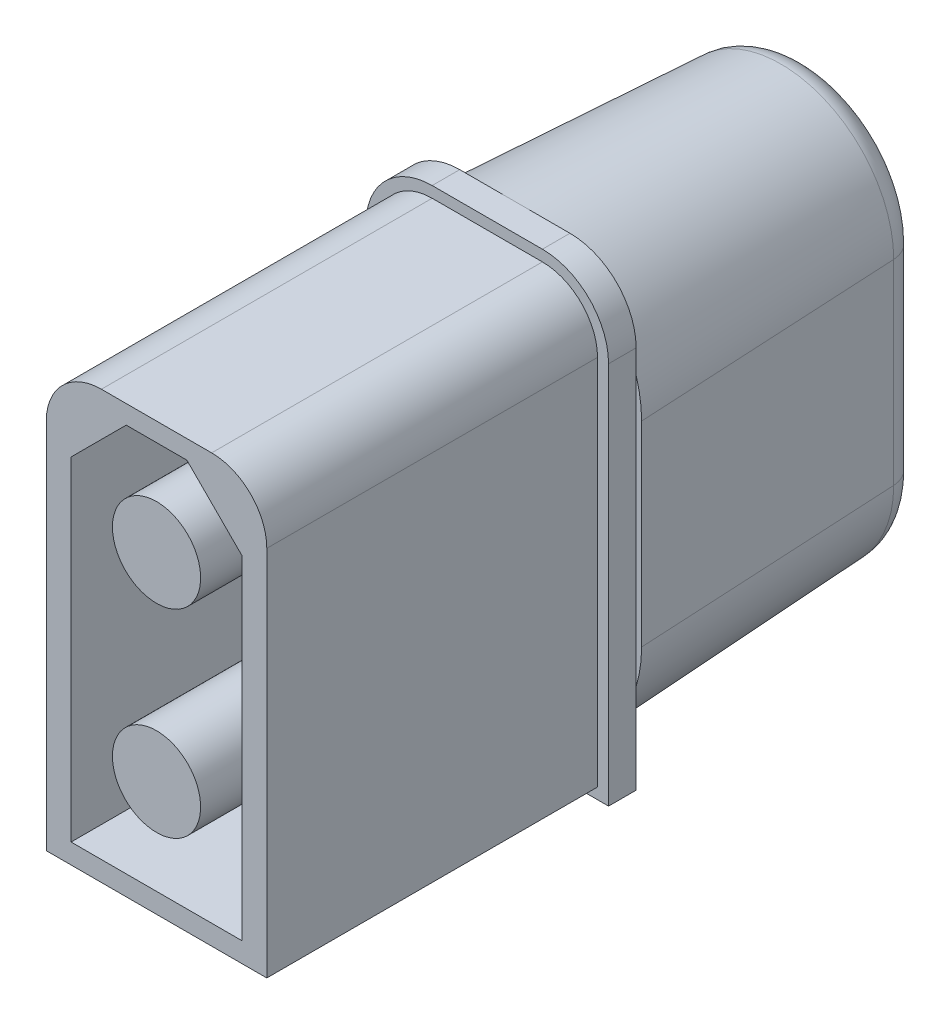
ISO-10303-21;
HEADER;
FILE_DESCRIPTION(('STEP AP214'),'2;1');
FILE_NAME('part.step','',(''),(''),'','','');
FILE_SCHEMA(('AUTOMOTIVE_DESIGN { 1 0 10303 214 1 1 1 1 }'));
ENDSEC;
DATA;
#1=APPLICATION_CONTEXT('core data for automotive mechanical design processes');
#2=APPLICATION_PROTOCOL_DEFINITION('international standard','automotive_design',2000,#1);
#3=PRODUCT_CONTEXT('',#1,'mechanical');
#4=PRODUCT('Part','Part','',(#3));
#5=PRODUCT_RELATED_PRODUCT_CATEGORY('part','',(#4));
#6=PRODUCT_DEFINITION_FORMATION('','',#4);
#7=PRODUCT_DEFINITION_CONTEXT('part definition',#1,'design');
#8=PRODUCT_DEFINITION('design','',#6,#7);
#9=PRODUCT_DEFINITION_SHAPE('','',#8);
#10=(LENGTH_UNIT() NAMED_UNIT(*) SI_UNIT(.MILLI.,.METRE.));
#11=(NAMED_UNIT(*) PLANE_ANGLE_UNIT() SI_UNIT($,.RADIAN.));
#12=(NAMED_UNIT(*) SI_UNIT($,.STERADIAN.) SOLID_ANGLE_UNIT());
#13=UNCERTAINTY_MEASURE_WITH_UNIT(LENGTH_MEASURE(1.E-05),#10,'distance_accuracy_value','');
#14=(GEOMETRIC_REPRESENTATION_CONTEXT(3) GLOBAL_UNCERTAINTY_ASSIGNED_CONTEXT((#13)) GLOBAL_UNIT_ASSIGNED_CONTEXT((#10,
#11,#12)) REPRESENTATION_CONTEXT('',''));
#15=CARTESIAN_POINT('',(0.,0.,0.));
#16=DIRECTION('',(0.,0.,1.));
#17=DIRECTION('',(1.,0.,0.));
#18=AXIS2_PLACEMENT_3D('',#15,#16,#17);
#19=CARTESIAN_POINT('',(3.1,10.65,-25.0327260079975));
#20=DIRECTION('',(0.,0.,1.));
#21=DIRECTION('',(1.,0.,0.));
#22=AXIS2_PLACEMENT_3D('',#19,#20,#21);
#23=CYLINDRICAL_SURFACE('',#22,1.6);
#24=CARTESIAN_POINT('',(3.1,10.65,-25.0327260079975));
#25=DIRECTION('',(0.,0.,-1.));
#26=DIRECTION('',(-1.,0.,0.));
#27=AXIS2_PLACEMENT_3D('',#24,#25,#26);
#28=CIRCLE('',#27,1.6);
#29=CARTESIAN_POINT('',(1.5,10.65,-25.0327260079975));
#30=VERTEX_POINT('',#29);
#31=EDGE_CURVE('E11',#30,#30,#28,.T.);
#32=ORIENTED_EDGE('',*,*,#31,.F.);
#33=EDGE_LOOP('',(#32));
#34=FACE_BOUND('',#33,.T.);
#35=CARTESIAN_POINT('',(3.1,10.65,-13.0327260079975));
#36=DIRECTION('',(0.,0.,-1.));
#37=DIRECTION('',(-1.,0.,0.));
#38=AXIS2_PLACEMENT_3D('',#35,#36,#37);
#39=CIRCLE('',#38,1.6);
#40=CARTESIAN_POINT('',(1.5,10.65,-13.0327260079975));
#41=VERTEX_POINT('',#40);
#42=EDGE_CURVE('E53',#41,#41,#39,.T.);
#43=ORIENTED_EDGE('',*,*,#42,.T.);
#44=EDGE_LOOP('',(#43));
#45=FACE_BOUND('',#44,.T.);
#46=ADVANCED_FACE('F51',(#34,#45),#23,.T.);
#47=CARTESIAN_POINT('',(0.,0.,-13.0327260079975));
#48=DIRECTION('',(0.,0.,-1.));
#49=DIRECTION('',(-1.,0.,0.));
#50=AXIS2_PLACEMENT_3D('',#47,#48,#49);
#51=PLANE('',#50);
#52=ORIENTED_EDGE('',*,*,#42,.F.);
#53=EDGE_LOOP('',(#52));
#54=FACE_BOUND('',#53,.T.);
#55=ADVANCED_FACE('F248',(#54),#51,.F.);
#56=CARTESIAN_POINT('',(3.1,3.45,-25.0327260079975));
#57=DIRECTION('',(0.,0.,1.));
#58=DIRECTION('',(1.,0.,0.));
#59=AXIS2_PLACEMENT_3D('',#56,#57,#58);
#60=CYLINDRICAL_SURFACE('',#59,1.6);
#61=CARTESIAN_POINT('',(3.1,3.45,-25.0327260079975));
#62=DIRECTION('',(0.,0.,-1.));
#63=DIRECTION('',(-1.,0.,0.));
#64=AXIS2_PLACEMENT_3D('',#61,#62,#63);
#65=CIRCLE('',#64,1.6);
#66=CARTESIAN_POINT('',(1.5,3.45,-25.0327260079975));
#67=VERTEX_POINT('',#66);
#68=EDGE_CURVE('E226',#67,#67,#65,.T.);
#69=ORIENTED_EDGE('',*,*,#68,.F.);
#70=EDGE_LOOP('',(#69));
#71=FACE_BOUND('',#70,.T.);
#72=CARTESIAN_POINT('',(3.1,3.45,-13.0327260079975));
#73=DIRECTION('',(0.,0.,-1.));
#74=DIRECTION('',(-1.,0.,0.));
#75=AXIS2_PLACEMENT_3D('',#72,#73,#74);
#76=CIRCLE('',#75,1.6);
#77=CARTESIAN_POINT('',(1.5,3.45,-13.0327260079975));
#78=VERTEX_POINT('',#77);
#79=EDGE_CURVE('E212',#78,#78,#76,.T.);
#80=ORIENTED_EDGE('',*,*,#79,.T.);
#81=EDGE_LOOP('',(#80));
#82=FACE_BOUND('',#81,.T.);
#83=ADVANCED_FACE('F237',(#71,#82),#60,.T.);
#84=CARTESIAN_POINT('',(0.,0.,-13.0327260079975));
#85=DIRECTION('',(0.,0.,-1.));
#86=DIRECTION('',(-1.,0.,0.));
#87=AXIS2_PLACEMENT_3D('',#84,#85,#86);
#88=PLANE('',#87);
#89=ORIENTED_EDGE('',*,*,#79,.F.);
#90=EDGE_LOOP('',(#89));
#91=FACE_BOUND('',#90,.T.);
#92=ADVANCED_FACE('F236',(#91),#88,.F.);
#93=CARTESIAN_POINT('',(0.,14.1,-25.0327260079975));
#94=DIRECTION('',(0.,1.,0.));
#95=DIRECTION('',(0.,0.,1.));
#96=AXIS2_PLACEMENT_3D('',#93,#94,#95);
#97=PLANE('',#96);
#98=DIRECTION('',(-1.,0.,0.));
#99=VECTOR('',#98,1.);
#100=CARTESIAN_POINT('',(0.,14.1,-13.0327260079975));
#101=LINE('',#100,#99);
#102=CARTESIAN_POINT('',(4.2,14.1,-13.0327260079975));
#103=VERTEX_POINT('',#102);
#104=CARTESIAN_POINT('',(2.,14.1,-13.0327260079975));
#105=VERTEX_POINT('',#104);
#106=EDGE_CURVE('E191',#103,#105,#101,.T.);
#107=ORIENTED_EDGE('',*,*,#106,.T.);
#108=DIRECTION('',(0.,0.,1.));
#109=VECTOR('',#108,1.);
#110=CARTESIAN_POINT('',(2.,14.1,-25.0327260079975));
#111=LINE('',#110,#109);
#112=CARTESIAN_POINT('',(2.,14.1,-25.0327260079975));
#113=VERTEX_POINT('',#112);
#114=EDGE_CURVE('E211',#113,#105,#111,.T.);
#115=ORIENTED_EDGE('',*,*,#114,.F.);
#116=DIRECTION('',(-1.,0.,0.));
#117=VECTOR('',#116,1.);
#118=CARTESIAN_POINT('',(0.,14.1,-25.0327260079975));
#119=LINE('',#118,#117);
#120=CARTESIAN_POINT('',(4.2,14.1,-25.0327260079975));
#121=VERTEX_POINT('',#120);
#122=EDGE_CURVE('E174',#121,#113,#119,.T.);
#123=ORIENTED_EDGE('',*,*,#122,.F.);
#124=DIRECTION('',(0.,0.,1.));
#125=VECTOR('',#124,1.);
#126=CARTESIAN_POINT('',(4.2,14.1,-25.0327260079975));
#127=LINE('',#126,#125);
#128=EDGE_CURVE('E202',#121,#103,#127,.T.);
#129=ORIENTED_EDGE('',*,*,#128,.T.);
#130=EDGE_LOOP('',(#107,#115,#123,#129));
#131=FACE_BOUND('',#130,.T.);
#132=ADVANCED_FACE('F238',(#131),#97,.F.);
#133=CARTESIAN_POINT('',(-6.05,6.05,-25.0327260079975));
#134=DIRECTION('',(-0.707106781186547,0.707106781186547,0.));
#135=DIRECTION('',(-0.707106781186548,-0.707106781186548,0.));
#136=AXIS2_PLACEMENT_3D('',#133,#134,#135);
#137=PLANE('',#136);
#138=DIRECTION('',(-0.707106781186548,-0.707106781186548,0.));
#139=VECTOR('',#138,1.);
#140=CARTESIAN_POINT('',(-6.05,6.05,-13.0327260079975));
#141=LINE('',#140,#139);
#142=CARTESIAN_POINT('',(0.,12.1,-13.0327260079975));
#143=VERTEX_POINT('',#142);
#144=EDGE_CURVE('E197',#105,#143,#141,.T.);
#145=ORIENTED_EDGE('',*,*,#144,.T.);
#146=DIRECTION('',(0.,0.,1.));
#147=VECTOR('',#146,1.);
#148=CARTESIAN_POINT('',(0.,12.1,-25.0327260079975));
#149=LINE('',#148,#147);
#150=CARTESIAN_POINT('',(0.,12.1,-25.0327260079975));
#151=VERTEX_POINT('',#150);
#152=EDGE_CURVE('E160',#151,#143,#149,.T.);
#153=ORIENTED_EDGE('',*,*,#152,.F.);
#154=DIRECTION('',(-0.707106781186548,-0.707106781186548,0.));
#155=VECTOR('',#154,1.);
#156=CARTESIAN_POINT('',(-6.05,6.05,-25.0327260079975));
#157=LINE('',#156,#155);
#158=EDGE_CURVE('E168',#113,#151,#157,.T.);
#159=ORIENTED_EDGE('',*,*,#158,.F.);
#160=ORIENTED_EDGE('',*,*,#114,.T.);
#161=EDGE_LOOP('',(#145,#153,#159,#160));
#162=FACE_BOUND('',#161,.T.);
#163=ADVANCED_FACE('F250',(#162),#137,.F.);
#164=CARTESIAN_POINT('',(0.,0.,-25.0327260079975));
#165=DIRECTION('',(-1.,0.,0.));
#166=DIRECTION('',(0.,0.,1.));
#167=AXIS2_PLACEMENT_3D('',#164,#165,#166);
#168=PLANE('',#167);
#169=DIRECTION('',(0.,-1.,0.));
#170=VECTOR('',#169,1.);
#171=CARTESIAN_POINT('',(0.,0.,-13.0327260079975));
#172=LINE('',#171,#170);
#173=CARTESIAN_POINT('',(0.,0.,-13.0327260079975));
#174=VERTEX_POINT('',#173);
#175=EDGE_CURVE('E152',#143,#174,#172,.T.);
#176=ORIENTED_EDGE('',*,*,#175,.T.);
#177=DIRECTION('',(0.,0.,1.));
#178=VECTOR('',#177,1.);
#179=CARTESIAN_POINT('',(0.,0.,-25.0327260079975));
#180=LINE('',#179,#178);
#181=CARTESIAN_POINT('',(0.,0.,-25.0327260079975));
#182=VERTEX_POINT('',#181);
#183=EDGE_CURVE('E148',#182,#174,#180,.T.);
#184=ORIENTED_EDGE('',*,*,#183,.F.);
#185=DIRECTION('',(0.,-1.,0.));
#186=VECTOR('',#185,1.);
#187=CARTESIAN_POINT('',(0.,0.,-25.0327260079975));
#188=LINE('',#187,#186);
#189=EDGE_CURVE('E151',#151,#182,#188,.T.);
#190=ORIENTED_EDGE('',*,*,#189,.F.);
#191=ORIENTED_EDGE('',*,*,#152,.T.);
#192=EDGE_LOOP('',(#176,#184,#190,#191));
#193=FACE_BOUND('',#192,.T.);
#194=ADVANCED_FACE('F146',(#193),#168,.F.);
#195=CARTESIAN_POINT('',(0.,0.,-25.0327260079975));
#196=DIRECTION('',(0.,-1.,0.));
#197=DIRECTION('',(0.,0.,-1.));
#198=AXIS2_PLACEMENT_3D('',#195,#196,#197);
#199=PLANE('',#198);
#200=DIRECTION('',(1.,0.,0.));
#201=VECTOR('',#200,1.);
#202=CARTESIAN_POINT('',(0.,0.,-13.0327260079975));
#203=LINE('',#202,#201);
#204=CARTESIAN_POINT('',(6.2,0.,-13.0327260079975));
#205=VERTEX_POINT('',#204);
#206=EDGE_CURVE('E199',#174,#205,#203,.T.);
#207=ORIENTED_EDGE('',*,*,#206,.T.);
#208=DIRECTION('',(0.,0.,1.));
#209=VECTOR('',#208,1.);
#210=CARTESIAN_POINT('',(6.2,0.,-25.0327260079975));
#211=LINE('',#210,#209);
#212=CARTESIAN_POINT('',(6.2,0.,-25.0327260079975));
#213=VERTEX_POINT('',#212);
#214=EDGE_CURVE('E158',#213,#205,#211,.T.);
#215=ORIENTED_EDGE('',*,*,#214,.F.);
#216=DIRECTION('',(1.,0.,0.));
#217=VECTOR('',#216,1.);
#218=CARTESIAN_POINT('',(0.,0.,-25.0327260079975));
#219=LINE('',#218,#217);
#220=EDGE_CURVE('E161',#182,#213,#219,.T.);
#221=ORIENTED_EDGE('',*,*,#220,.F.);
#222=ORIENTED_EDGE('',*,*,#183,.T.);
#223=EDGE_LOOP('',(#207,#215,#221,#222));
#224=FACE_BOUND('',#223,.T.);
#225=ADVANCED_FACE('F165',(#224),#199,.F.);
#226=CARTESIAN_POINT('',(6.2,0.,-25.0327260079975));
#227=DIRECTION('',(1.,0.,0.));
#228=DIRECTION('',(0.,0.,-1.));
#229=AXIS2_PLACEMENT_3D('',#226,#227,#228);
#230=PLANE('',#229);
#231=DIRECTION('',(0.,1.,0.));
#232=VECTOR('',#231,1.);
#233=CARTESIAN_POINT('',(6.2,0.,-13.0327260079975));
#234=LINE('',#233,#232);
#235=CARTESIAN_POINT('',(6.2,12.1,-13.0327260079975));
#236=VERTEX_POINT('',#235);
#237=EDGE_CURVE('E110',#205,#236,#234,.T.);
#238=ORIENTED_EDGE('',*,*,#237,.T.);
#239=DIRECTION('',(0.,0.,1.));
#240=VECTOR('',#239,1.);
#241=CARTESIAN_POINT('',(6.2,12.1,-25.0327260079975));
#242=LINE('',#241,#240);
#243=CARTESIAN_POINT('',(6.2,12.1,-25.0327260079975));
#244=VERTEX_POINT('',#243);
#245=EDGE_CURVE('E70',#244,#236,#242,.T.);
#246=ORIENTED_EDGE('',*,*,#245,.F.);
#247=DIRECTION('',(0.,1.,0.));
#248=VECTOR('',#247,1.);
#249=CARTESIAN_POINT('',(6.2,0.,-25.0327260079975));
#250=LINE('',#249,#248);
#251=EDGE_CURVE('E164',#213,#244,#250,.T.);
#252=ORIENTED_EDGE('',*,*,#251,.F.);
#253=ORIENTED_EDGE('',*,*,#214,.T.);
#254=EDGE_LOOP('',(#238,#246,#252,#253));
#255=FACE_BOUND('',#254,.T.);
#256=ADVANCED_FACE('F286',(#255),#230,.F.);
#257=CARTESIAN_POINT('',(5.1,12.7779728133344,-25.0327260079975));
#258=DIRECTION('',(0.,0.,1.));
#259=DIRECTION('',(1.,0.,0.));
#260=AXIS2_PLACEMENT_3D('',#257,#258,#259);
#261=CYLINDRICAL_SURFACE('',#260,2.);
#262=CARTESIAN_POINT('',(5.1,12.7779728133344,-13.0327260079975));
#263=DIRECTION('',(0.,0.,-1.));
#264=DIRECTION('',(-1.,0.,0.));
#265=AXIS2_PLACEMENT_3D('',#262,#263,#264);
#266=CIRCLE('',#265,2.);
#267=CARTESIAN_POINT('',(5.09999999999999,14.7779728133344,-13.0327260079975));
#268=VERTEX_POINT('',#267);
#269=CARTESIAN_POINT('',(7.1,12.7779728133344,-13.0327260079975));
#270=VERTEX_POINT('',#269);
#271=EDGE_CURVE('E178',#268,#270,#266,.T.);
#272=ORIENTED_EDGE('',*,*,#271,.T.);
#273=DIRECTION('',(0.,0.,1.));
#274=VECTOR('',#273,1.);
#275=CARTESIAN_POINT('',(7.1,12.7779728133344,-25.0327260079975));
#276=LINE('',#275,#274);
#277=CARTESIAN_POINT('',(7.1,12.7779728133344,-25.0327260079975));
#278=VERTEX_POINT('',#277);
#279=EDGE_CURVE('E210',#278,#270,#276,.T.);
#280=ORIENTED_EDGE('',*,*,#279,.F.);
#281=CARTESIAN_POINT('',(5.1,12.7779728133344,-25.0327260079975));
#282=DIRECTION('',(0.,0.,-1.));
#283=DIRECTION('',(-1.,0.,0.));
#284=AXIS2_PLACEMENT_3D('',#281,#282,#283);
#285=CIRCLE('',#284,2.);
#286=CARTESIAN_POINT('',(5.09999999999999,14.7779728133344,-25.0327260079975));
#287=VERTEX_POINT('',#286);
#288=EDGE_CURVE('E204',#287,#278,#285,.T.);
#289=ORIENTED_EDGE('',*,*,#288,.F.);
#290=DIRECTION('',(0.,0.,1.));
#291=VECTOR('',#290,1.);
#292=CARTESIAN_POINT('',(5.09999999999999,14.7779728133344,-25.0327260079975));
#293=LINE('',#292,#291);
#294=EDGE_CURVE('E176',#287,#268,#293,.T.);
#295=ORIENTED_EDGE('',*,*,#294,.T.);
#296=EDGE_LOOP('',(#272,#280,#289,#295));
#297=FACE_BOUND('',#296,.T.);
#298=ADVANCED_FACE('F295',(#297),#261,.T.);
#299=CARTESIAN_POINT('',(7.1,0.,-25.0327260079975));
#300=DIRECTION('',(-1.,0.,0.));
#301=DIRECTION('',(0.,-1.,0.));
#302=AXIS2_PLACEMENT_3D('',#299,#300,#301);
#303=PLANE('',#302);
#304=DIRECTION('',(0.,-1.,0.));
#305=VECTOR('',#304,1.);
#306=CARTESIAN_POINT('',(7.1,0.,-13.0327260079975));
#307=LINE('',#306,#305);
#308=CARTESIAN_POINT('',(7.1,-0.722027186665562,-13.0327260079975));
#309=VERTEX_POINT('',#308);
#310=EDGE_CURVE('E181',#270,#309,#307,.T.);
#311=ORIENTED_EDGE('',*,*,#310,.T.);
#312=DIRECTION('',(0.,0.,1.));
#313=VECTOR('',#312,1.);
#314=CARTESIAN_POINT('',(7.1,-0.722027186665562,-25.0327260079975));
#315=LINE('',#314,#313);
#316=CARTESIAN_POINT('',(7.1,-0.722027186665562,-25.0327260079975));
#317=VERTEX_POINT('',#316);
#318=EDGE_CURVE('E228',#317,#309,#315,.T.);
#319=ORIENTED_EDGE('',*,*,#318,.F.);
#320=DIRECTION('',(0.,-1.,0.));
#321=VECTOR('',#320,1.);
#322=CARTESIAN_POINT('',(7.1,0.,-25.0327260079975));
#323=LINE('',#322,#321);
#324=EDGE_CURVE('E125',#278,#317,#323,.T.);
#325=ORIENTED_EDGE('',*,*,#324,.F.);
#326=ORIENTED_EDGE('',*,*,#279,.T.);
#327=EDGE_LOOP('',(#311,#319,#325,#326));
#328=FACE_BOUND('',#327,.T.);
#329=ADVANCED_FACE('F314',(#328),#303,.F.);
#330=CARTESIAN_POINT('',(0.,-0.722027186665563,-25.0327260079975));
#331=DIRECTION('',(0.,1.,0.));
#332=DIRECTION('',(-1.,0.,0.));
#333=AXIS2_PLACEMENT_3D('',#330,#331,#332);
#334=PLANE('',#333);
#335=DIRECTION('',(-1.,0.,0.));
#336=VECTOR('',#335,1.);
#337=CARTESIAN_POINT('',(0.,-0.722027186665563,-13.0327260079975));
#338=LINE('',#337,#336);
#339=CARTESIAN_POINT('',(-0.900000000000001,-0.722027186665563,-13.0327260079975));
#340=VERTEX_POINT('',#339);
#341=EDGE_CURVE('E188',#309,#340,#338,.T.);
#342=ORIENTED_EDGE('',*,*,#341,.T.);
#343=DIRECTION('',(0.,0.,1.));
#344=VECTOR('',#343,1.);
#345=CARTESIAN_POINT('',(-0.900000000000001,-0.722027186665563,-25.0327260079975));
#346=LINE('',#345,#344);
#347=CARTESIAN_POINT('',(-0.900000000000001,-0.722027186665563,-25.0327260079975));
#348=VERTEX_POINT('',#347);
#349=EDGE_CURVE('E224',#348,#340,#346,.T.);
#350=ORIENTED_EDGE('',*,*,#349,.F.);
#351=DIRECTION('',(-1.,0.,0.));
#352=VECTOR('',#351,1.);
#353=CARTESIAN_POINT('',(0.,-0.722027186665563,-25.0327260079975));
#354=LINE('',#353,#352);
#355=EDGE_CURVE('E331',#317,#348,#354,.T.);
#356=ORIENTED_EDGE('',*,*,#355,.F.);
#357=ORIENTED_EDGE('',*,*,#318,.T.);
#358=EDGE_LOOP('',(#342,#350,#356,#357));
#359=FACE_BOUND('',#358,.T.);
#360=ADVANCED_FACE('F309',(#359),#334,.F.);
#361=CARTESIAN_POINT('',(-0.900000000000001,0.,-25.0327260079975));
#362=DIRECTION('',(1.,0.,0.));
#363=DIRECTION('',(0.,1.,0.));
#364=AXIS2_PLACEMENT_3D('',#361,#362,#363);
#365=PLANE('',#364);
#366=DIRECTION('',(0.,1.,0.));
#367=VECTOR('',#366,1.);
#368=CARTESIAN_POINT('',(-0.900000000000001,0.,-13.0327260079975));
#369=LINE('',#368,#367);
#370=CARTESIAN_POINT('',(-0.9,12.7779728133344,-13.0327260079975));
#371=VERTEX_POINT('',#370);
#372=EDGE_CURVE('E187',#340,#371,#369,.T.);
#373=ORIENTED_EDGE('',*,*,#372,.T.);
#374=DIRECTION('',(0.,0.,1.));
#375=VECTOR('',#374,1.);
#376=CARTESIAN_POINT('',(-0.9,12.7779728133344,-25.0327260079975));
#377=LINE('',#376,#375);
#378=CARTESIAN_POINT('',(-0.9,12.7779728133344,-25.0327260079975));
#379=VERTEX_POINT('',#378);
#380=EDGE_CURVE('E219',#379,#371,#377,.T.);
#381=ORIENTED_EDGE('',*,*,#380,.F.);
#382=DIRECTION('',(0.,1.,0.));
#383=VECTOR('',#382,1.);
#384=CARTESIAN_POINT('',(-0.900000000000001,0.,-25.0327260079975));
#385=LINE('',#384,#383);
#386=EDGE_CURVE('E339',#348,#379,#385,.T.);
#387=ORIENTED_EDGE('',*,*,#386,.F.);
#388=ORIENTED_EDGE('',*,*,#349,.T.);
#389=EDGE_LOOP('',(#373,#381,#387,#388));
#390=FACE_BOUND('',#389,.T.);
#391=ADVANCED_FACE('F308',(#390),#365,.F.);
#392=CARTESIAN_POINT('',(1.1,12.7779728133344,-25.0327260079975));
#393=DIRECTION('',(0.,0.,1.));
#394=DIRECTION('',(1.,0.,0.));
#395=AXIS2_PLACEMENT_3D('',#392,#393,#394);
#396=CYLINDRICAL_SURFACE('',#395,2.);
#397=CARTESIAN_POINT('',(1.1,12.7779728133344,-13.0327260079975));
#398=DIRECTION('',(0.,0.,-1.));
#399=DIRECTION('',(-1.,0.,0.));
#400=AXIS2_PLACEMENT_3D('',#397,#398,#399);
#401=CIRCLE('',#400,2.);
#402=CARTESIAN_POINT('',(1.10000000000001,14.7779728133344,-13.0327260079975));
#403=VERTEX_POINT('',#402);
#404=EDGE_CURVE('E186',#371,#403,#401,.T.);
#405=ORIENTED_EDGE('',*,*,#404,.T.);
#406=DIRECTION('',(0.,0.,1.));
#407=VECTOR('',#406,1.);
#408=CARTESIAN_POINT('',(1.10000000000001,14.7779728133344,-25.0327260079975));
#409=LINE('',#408,#407);
#410=CARTESIAN_POINT('',(1.10000000000001,14.7779728133344,-25.0327260079975));
#411=VERTEX_POINT('',#410);
#412=EDGE_CURVE('E220',#411,#403,#409,.T.);
#413=ORIENTED_EDGE('',*,*,#412,.F.);
#414=CARTESIAN_POINT('',(1.1,12.7779728133344,-25.0327260079975));
#415=DIRECTION('',(0.,0.,-1.));
#416=DIRECTION('',(-1.,0.,0.));
#417=AXIS2_PLACEMENT_3D('',#414,#415,#416);
#418=CIRCLE('',#417,2.);
#419=EDGE_CURVE('E347',#379,#411,#418,.T.);
#420=ORIENTED_EDGE('',*,*,#419,.F.);
#421=ORIENTED_EDGE('',*,*,#380,.T.);
#422=EDGE_LOOP('',(#405,#413,#420,#421));
#423=FACE_BOUND('',#422,.T.);
#424=ADVANCED_FACE('F305',(#423),#396,.T.);
#425=CARTESIAN_POINT('',(0.,14.7779728133344,-25.0327260079975));
#426=DIRECTION('',(0.,-1.,0.));
#427=DIRECTION('',(1.,0.,0.));
#428=AXIS2_PLACEMENT_3D('',#425,#426,#427);
#429=PLANE('',#428);
#430=DIRECTION('',(1.,0.,0.));
#431=VECTOR('',#430,1.);
#432=CARTESIAN_POINT('',(0.,14.7779728133344,-13.0327260079975));
#433=LINE('',#432,#431);
#434=EDGE_CURVE('E195',#403,#268,#433,.T.);
#435=ORIENTED_EDGE('',*,*,#434,.T.);
#436=ORIENTED_EDGE('',*,*,#294,.F.);
#437=DIRECTION('',(1.,0.,0.));
#438=VECTOR('',#437,1.);
#439=CARTESIAN_POINT('',(0.,14.7779728133344,-25.0327260079975));
#440=LINE('',#439,#438);
#441=EDGE_CURVE('E349',#411,#287,#440,.T.);
#442=ORIENTED_EDGE('',*,*,#441,.F.);
#443=ORIENTED_EDGE('',*,*,#412,.T.);
#444=EDGE_LOOP('',(#435,#436,#442,#443));
#445=FACE_BOUND('',#444,.T.);
#446=ADVANCED_FACE('F289',(#445),#429,.F.);
#447=CARTESIAN_POINT('',(9.15,9.15,-25.0327260079975));
#448=DIRECTION('',(0.707106781186547,0.707106781186547,0.));
#449=DIRECTION('',(-0.707106781186548,0.707106781186548,0.));
#450=AXIS2_PLACEMENT_3D('',#447,#448,#449);
#451=PLANE('',#450);
#452=DIRECTION('',(-0.707106781186548,0.707106781186548,0.));
#453=VECTOR('',#452,1.);
#454=CARTESIAN_POINT('',(9.15,9.15,-13.0327260079975));
#455=LINE('',#454,#453);
#456=EDGE_CURVE('E114',#236,#103,#455,.T.);
#457=ORIENTED_EDGE('',*,*,#456,.T.);
#458=ORIENTED_EDGE('',*,*,#128,.F.);
#459=DIRECTION('',(-0.707106781186548,0.707106781186548,0.));
#460=VECTOR('',#459,1.);
#461=CARTESIAN_POINT('',(9.15,9.15,-25.0327260079975));
#462=LINE('',#461,#460);
#463=EDGE_CURVE('E180',#244,#121,#462,.T.);
#464=ORIENTED_EDGE('',*,*,#463,.F.);
#465=ORIENTED_EDGE('',*,*,#245,.T.);
#466=EDGE_LOOP('',(#457,#458,#464,#465));
#467=FACE_BOUND('',#466,.T.);
#468=ADVANCED_FACE('F276',(#467),#451,.F.);
#469=CARTESIAN_POINT('',(0.,0.,-13.0327260079975));
#470=DIRECTION('',(0.,0.,-1.));
#471=DIRECTION('',(-1.,0.,0.));
#472=AXIS2_PLACEMENT_3D('',#469,#470,#471);
#473=PLANE('',#472);
#474=ORIENTED_EDGE('',*,*,#271,.F.);
#475=ORIENTED_EDGE('',*,*,#434,.F.);
#476=ORIENTED_EDGE('',*,*,#404,.F.);
#477=ORIENTED_EDGE('',*,*,#372,.F.);
#478=ORIENTED_EDGE('',*,*,#341,.F.);
#479=ORIENTED_EDGE('',*,*,#310,.F.);
#480=EDGE_LOOP('',(#474,#475,#476,#477,#478,#479));
#481=FACE_BOUND('',#480,.T.);
#482=ORIENTED_EDGE('',*,*,#106,.F.);
#483=ORIENTED_EDGE('',*,*,#456,.F.);
#484=ORIENTED_EDGE('',*,*,#237,.F.);
#485=ORIENTED_EDGE('',*,*,#206,.F.);
#486=ORIENTED_EDGE('',*,*,#175,.F.);
#487=ORIENTED_EDGE('',*,*,#144,.F.);
#488=EDGE_LOOP('',(#482,#483,#484,#485,#486,#487));
#489=FACE_BOUND('',#488,.T.);
#490=ADVANCED_FACE('F268',(#481,#489),#473,.F.);
#491=CARTESIAN_POINT('',(5.09999999999998,15.1779728133344,-25.0327260079975));
#492=DIRECTION('',(0.,0.,1.));
#493=DIRECTION('',(-1.,0.,0.));
#494=AXIS2_PLACEMENT_3D('',#491,#492,#493);
#495=PLANE('',#494);
#496=ORIENTED_EDGE('',*,*,#31,.T.);
#497=EDGE_LOOP('',(#496));
#498=FACE_BOUND('',#497,.T.);
#499=ORIENTED_EDGE('',*,*,#68,.T.);
#500=EDGE_LOOP('',(#499));
#501=FACE_BOUND('',#500,.T.);
#502=ORIENTED_EDGE('',*,*,#463,.T.);
#503=ORIENTED_EDGE('',*,*,#122,.T.);
#504=ORIENTED_EDGE('',*,*,#158,.T.);
#505=ORIENTED_EDGE('',*,*,#189,.T.);
#506=ORIENTED_EDGE('',*,*,#220,.T.);
#507=ORIENTED_EDGE('',*,*,#251,.T.);
#508=EDGE_LOOP('',(#502,#503,#504,#505,#506,#507));
#509=FACE_BOUND('',#508,.T.);
#510=ADVANCED_FACE('F169',(#498,#501,#509),#495,.T.);
#511=ORIENTED_EDGE('',*,*,#441,.T.);
#512=ORIENTED_EDGE('',*,*,#288,.T.);
#513=ORIENTED_EDGE('',*,*,#324,.T.);
#514=ORIENTED_EDGE('',*,*,#355,.T.);
#515=ORIENTED_EDGE('',*,*,#386,.T.);
#516=ORIENTED_EDGE('',*,*,#419,.T.);
#517=EDGE_LOOP('',(#511,#512,#513,#514,#515,#516));
#518=FACE_BOUND('',#517,.T.);
#519=DIRECTION('',(-1.,0.,0.));
#520=VECTOR('',#519,1.);
#521=CARTESIAN_POINT('',(0.,15.1779728133344,-25.0327260079975));
#522=LINE('',#521,#520);
#523=CARTESIAN_POINT('',(5.09999999999998,15.1779728133344,-25.0327260079975));
#524=VERTEX_POINT('',#523);
#525=CARTESIAN_POINT('',(1.10000000000001,15.1779728133344,-25.0327260079975));
#526=VERTEX_POINT('',#525);
#527=EDGE_CURVE('E518',#524,#526,#522,.T.);
#528=ORIENTED_EDGE('',*,*,#527,.T.);
#529=CARTESIAN_POINT('',(1.1,12.7779728133344,-25.0327260079975));
#530=DIRECTION('',(0.,0.,1.));
#531=DIRECTION('',(1.,0.,0.));
#532=AXIS2_PLACEMENT_3D('',#529,#530,#531);
#533=CIRCLE('',#532,2.4);
#534=CARTESIAN_POINT('',(-1.3,12.7779728133344,-25.0327260079975));
#535=VERTEX_POINT('',#534);
#536=EDGE_CURVE('E546',#526,#535,#533,.T.);
#537=ORIENTED_EDGE('',*,*,#536,.T.);
#538=DIRECTION('',(0.,-1.,0.));
#539=VECTOR('',#538,1.);
#540=CARTESIAN_POINT('',(-1.3,0.,-25.0327260079975));
#541=LINE('',#540,#539);
#542=CARTESIAN_POINT('',(-1.3,-1.12202718666556,-25.0327260079975));
#543=VERTEX_POINT('',#542);
#544=EDGE_CURVE('E543',#535,#543,#541,.T.);
#545=ORIENTED_EDGE('',*,*,#544,.T.);
#546=DIRECTION('',(1.,0.,0.));
#547=VECTOR('',#546,1.);
#548=CARTESIAN_POINT('',(0.,-1.12202718666556,-25.0327260079975));
#549=LINE('',#548,#547);
#550=CARTESIAN_POINT('',(7.5,-1.12202718666556,-25.0327260079975));
#551=VERTEX_POINT('',#550);
#552=EDGE_CURVE('E539',#543,#551,#549,.T.);
#553=ORIENTED_EDGE('',*,*,#552,.T.);
#554=DIRECTION('',(0.,1.,0.));
#555=VECTOR('',#554,1.);
#556=CARTESIAN_POINT('',(7.5,0.,-25.0327260079975));
#557=LINE('',#556,#555);
#558=CARTESIAN_POINT('',(7.5,12.7779728133344,-25.0327260079975));
#559=VERTEX_POINT('',#558);
#560=EDGE_CURVE('E536',#551,#559,#557,.T.);
#561=ORIENTED_EDGE('',*,*,#560,.T.);
#562=CARTESIAN_POINT('',(5.1,12.7779728133344,-25.0327260079975));
#563=DIRECTION('',(0.,0.,1.));
#564=DIRECTION('',(1.,0.,0.));
#565=AXIS2_PLACEMENT_3D('',#562,#563,#564);
#566=CIRCLE('',#565,2.4);
#567=EDGE_CURVE('E531',#559,#524,#566,.T.);
#568=ORIENTED_EDGE('',*,*,#567,.T.);
#569=EDGE_LOOP('',(#528,#537,#545,#553,#561,#568));
#570=FACE_BOUND('',#569,.T.);
#571=ADVANCED_FACE('F270',(#518,#570),#495,.T.);
#572=CARTESIAN_POINT('',(0.,0.,-26.0327260079975));
#573=DIRECTION('',(0.,0.,-1.));
#574=DIRECTION('',(1.,0.,0.));
#575=AXIS2_PLACEMENT_3D('',#572,#573,#574);
#576=PLANE('',#575);
#577=CARTESIAN_POINT('',(3.1,3.42797281333444,-26.0327260079975));
#578=DIRECTION('',(0.,0.,1.));
#579=DIRECTION('',(1.,0.,0.));
#580=AXIS2_PLACEMENT_3D('',#577,#578,#579);
#581=CIRCLE('',#580,2.75);
#582=CARTESIAN_POINT('',(5.85,3.42797281333444,-26.0327260079975));
#583=VERTEX_POINT('',#582);
#584=EDGE_CURVE('E488',#583,#583,#581,.T.);
#585=ORIENTED_EDGE('',*,*,#584,.F.);
#586=EDGE_LOOP('',(#585));
#587=FACE_BOUND('',#586,.T.);
#588=ADVANCED_FACE('F277',(#587),#576,.T.);
#589=CARTESIAN_POINT('',(3.1,10.6279728133344,-26.0327260079975));
#590=DIRECTION('',(0.,0.,1.));
#591=DIRECTION('',(1.,0.,0.));
#592=AXIS2_PLACEMENT_3D('',#589,#590,#591);
#593=CIRCLE('',#592,2.75);
#594=CARTESIAN_POINT('',(5.85,10.6279728133344,-26.0327260079975));
#595=VERTEX_POINT('',#594);
#596=EDGE_CURVE('E580',#595,#595,#593,.T.);
#597=ORIENTED_EDGE('',*,*,#596,.F.);
#598=EDGE_LOOP('',(#597));
#599=FACE_BOUND('',#598,.T.);
#600=ADVANCED_FACE('F595',(#599),#576,.T.);
#601=CARTESIAN_POINT('',(3.1,3.42797281333444,-36.6327260079975));
#602=DIRECTION('',(0.,0.,1.));
#603=DIRECTION('',(-1.,0.,0.));
#604=AXIS2_PLACEMENT_3D('',#601,#602,#603);
#605=CYLINDRICAL_SURFACE('',#604,2.75);
#606=CARTESIAN_POINT('',(3.1,3.42797281333444,-36.6327260079975));
#607=DIRECTION('',(0.,0.,1.));
#608=DIRECTION('',(1.,0.,0.));
#609=AXIS2_PLACEMENT_3D('',#606,#607,#608);
#610=CIRCLE('',#609,2.75);
#611=CARTESIAN_POINT('',(5.85,3.42797281333444,-36.6327260079975));
#612=VERTEX_POINT('',#611);
#613=EDGE_CURVE('E578',#612,#612,#610,.T.);
#614=ORIENTED_EDGE('',*,*,#613,.F.);
#615=EDGE_LOOP('',(#614));
#616=FACE_BOUND('',#615,.T.);
#617=ORIENTED_EDGE('',*,*,#584,.T.);
#618=EDGE_LOOP('',(#617));
#619=FACE_BOUND('',#618,.T.);
#620=ADVANCED_FACE('F282',(#616,#619),#605,.F.);
#621=CARTESIAN_POINT('',(3.1,10.6279728133344,-36.6327260079975));
#622=DIRECTION('',(0.,0.,1.));
#623=DIRECTION('',(-1.,0.,0.));
#624=AXIS2_PLACEMENT_3D('',#621,#622,#623);
#625=CYLINDRICAL_SURFACE('',#624,2.75);
#626=CARTESIAN_POINT('',(3.1,10.6279728133344,-36.6327260079975));
#627=DIRECTION('',(0.,0.,1.));
#628=DIRECTION('',(1.,0.,0.));
#629=AXIS2_PLACEMENT_3D('',#626,#627,#628);
#630=CIRCLE('',#629,2.75);
#631=CARTESIAN_POINT('',(5.85,10.6279728133344,-36.6327260079975));
#632=VERTEX_POINT('',#631);
#633=EDGE_CURVE('E583',#632,#632,#630,.T.);
#634=ORIENTED_EDGE('',*,*,#633,.F.);
#635=EDGE_LOOP('',(#634));
#636=FACE_BOUND('',#635,.T.);
#637=ORIENTED_EDGE('',*,*,#596,.T.);
#638=EDGE_LOOP('',(#637));
#639=FACE_BOUND('',#638,.T.);
#640=ADVANCED_FACE('F591',(#636,#639),#625,.F.);
#641=CARTESIAN_POINT('',(3.1,10.5779728133344,-36.6327260079975));
#642=DIRECTION('',(0.,0.,-1.));
#643=DIRECTION('',(1.,0.,0.));
#644=AXIS2_PLACEMENT_3D('',#641,#642,#643);
#645=PLANE('',#644);
#646=DIRECTION('',(0.,-1.,0.));
#647=VECTOR('',#646,1.);
#648=CARTESIAN_POINT('',(6.19551297288488,10.5779728133344,-36.6327260079975));
#649=LINE('',#648,#647);
#650=CARTESIAN_POINT('',(6.19551297288488,3.47797281333444,-36.6327260079975));
#651=VERTEX_POINT('',#650);
#652=CARTESIAN_POINT('',(6.19551297288488,10.5779728133344,-36.6327260079975));
#653=VERTEX_POINT('',#652);
#654=EDGE_CURVE('E496',#651,#653,#649,.F.);
#655=ORIENTED_EDGE('',*,*,#654,.F.);
#656=CARTESIAN_POINT('',(3.1,3.47797281333444,-36.6327260079975));
#657=DIRECTION('',(0.,0.,1.));
#658=DIRECTION('',(1.,0.,0.));
#659=AXIS2_PLACEMENT_3D('',#656,#657,#658);
#660=CIRCLE('',#659,3.09551297288488);
#661=CARTESIAN_POINT('',(0.00448702711511838,3.47797281333444,-36.6327260079975));
#662=VERTEX_POINT('',#661);
#663=EDGE_CURVE('E504',#662,#651,#660,.T.);
#664=ORIENTED_EDGE('',*,*,#663,.F.);
#665=DIRECTION('',(0.,1.,0.));
#666=VECTOR('',#665,1.);
#667=CARTESIAN_POINT('',(0.00448702711511838,3.47797281333444,-36.6327260079975));
#668=LINE('',#667,#666);
#669=CARTESIAN_POINT('',(0.00448702711511838,10.5779728133344,-36.6327260079975));
#670=VERTEX_POINT('',#669);
#671=EDGE_CURVE('E485',#670,#662,#668,.F.);
#672=ORIENTED_EDGE('',*,*,#671,.F.);
#673=CARTESIAN_POINT('',(3.1,10.5779728133344,-36.6327260079975));
#674=DIRECTION('',(0.,0.,1.));
#675=DIRECTION('',(1.,0.,0.));
#676=AXIS2_PLACEMENT_3D('',#673,#674,#675);
#677=CIRCLE('',#676,3.09551297288488);
#678=EDGE_CURVE('E497',#653,#670,#677,.T.);
#679=ORIENTED_EDGE('',*,*,#678,.F.);
#680=EDGE_LOOP('',(#655,#664,#672,#679));
#681=FACE_BOUND('',#680,.T.);
#682=ORIENTED_EDGE('',*,*,#633,.T.);
#683=EDGE_LOOP('',(#682));
#684=FACE_BOUND('',#683,.T.);
#685=ORIENTED_EDGE('',*,*,#613,.T.);
#686=EDGE_LOOP('',(#685));
#687=FACE_BOUND('',#686,.T.);
#688=ADVANCED_FACE('F586',(#681,#684,#687),#645,.T.);
#689=CARTESIAN_POINT('',(0.00448702711511838,10.5779728133344,-35.6327260079975));
#690=DIRECTION('',(0.,-1.,0.));
#691=DIRECTION('',(0.,0.,1.));
#692=AXIS2_PLACEMENT_3D('',#689,#690,#691);
#693=CYLINDRICAL_SURFACE('',#692,1.);
#694=CARTESIAN_POINT('',(0.00448702711511751,3.47797281333444,-35.6327260079975));
#695=DIRECTION('',(0.,-1.,0.));
#696=DIRECTION('',(0.,0.,-1.));
#697=AXIS2_PLACEMENT_3D('',#694,#695,#696);
#698=CIRCLE('',#697,1.);
#699=CARTESIAN_POINT('',(-0.994142507639457,3.47797281333444,-35.6850619642405));
#700=VERTEX_POINT('',#699);
#701=EDGE_CURVE('E469',#700,#662,#698,.T.);
#702=ORIENTED_EDGE('',*,*,#701,.F.);
#703=DIRECTION('',(0.,-1.,0.));
#704=VECTOR('',#703,1.);
#705=CARTESIAN_POINT('',(-0.994142507639456,10.5779728133344,-35.6850619642405));
#706=LINE('',#705,#704);
#707=CARTESIAN_POINT('',(-0.994142507639456,10.5779728133344,-35.6850619642405));
#708=VERTEX_POINT('',#707);
#709=EDGE_CURVE('E472',#700,#708,#706,.F.);
#710=ORIENTED_EDGE('',*,*,#709,.T.);
#711=CARTESIAN_POINT('',(0.00448702711511838,10.5779728133344,-35.6327260079975));
#712=DIRECTION('',(0.,-1.,0.));
#713=DIRECTION('',(0.,0.,-1.));
#714=AXIS2_PLACEMENT_3D('',#711,#712,#713);
#715=CIRCLE('',#714,1.);
#716=EDGE_CURVE('E184',#708,#670,#715,.T.);
#717=ORIENTED_EDGE('',*,*,#716,.T.);
#718=ORIENTED_EDGE('',*,*,#671,.T.);
#719=EDGE_LOOP('',(#702,#710,#717,#718));
#720=FACE_BOUND('',#719,.T.);
#721=ADVANCED_FACE('F477',(#720),#693,.T.);
#722=CARTESIAN_POINT('',(6.19551297288488,10.5779728133344,-35.6327260079975));
#723=DIRECTION('',(0.,1.,0.));
#724=DIRECTION('',(0.,0.,-1.));
#725=AXIS2_PLACEMENT_3D('',#722,#723,#724);
#726=CYLINDRICAL_SURFACE('',#725,1.);
#727=CARTESIAN_POINT('',(6.19551297288488,3.47797281333444,-35.6327260079975));
#728=DIRECTION('',(0.,-1.,0.));
#729=DIRECTION('',(0.,0.,-1.));
#730=AXIS2_PLACEMENT_3D('',#727,#728,#729);
#731=CIRCLE('',#730,1.);
#732=CARTESIAN_POINT('',(7.19414250763946,3.47797281333444,-35.6850619642405));
#733=VERTEX_POINT('',#732);
#734=EDGE_CURVE('E468',#651,#733,#731,.T.);
#735=ORIENTED_EDGE('',*,*,#734,.F.);
#736=ORIENTED_EDGE('',*,*,#654,.T.);
#737=CARTESIAN_POINT('',(6.19551297288488,10.5779728133344,-35.6327260079975));
#738=DIRECTION('',(0.,-1.,0.));
#739=DIRECTION('',(0.,0.,-1.));
#740=AXIS2_PLACEMENT_3D('',#737,#738,#739);
#741=CIRCLE('',#740,1.);
#742=CARTESIAN_POINT('',(7.19414250763946,10.5779728133344,-35.6850619642405));
#743=VERTEX_POINT('',#742);
#744=EDGE_CURVE('E482',#653,#743,#741,.T.);
#745=ORIENTED_EDGE('',*,*,#744,.T.);
#746=DIRECTION('',(0.,1.,0.));
#747=VECTOR('',#746,1.);
#748=CARTESIAN_POINT('',(7.19414250763946,3.47797281333444,-35.6850619642405));
#749=LINE('',#748,#747);
#750=EDGE_CURVE('E473',#743,#733,#749,.F.);
#751=ORIENTED_EDGE('',*,*,#750,.T.);
#752=EDGE_LOOP('',(#735,#736,#745,#751));
#753=FACE_BOUND('',#752,.T.);
#754=ADVANCED_FACE('F682',(#753),#726,.T.);
#755=CARTESIAN_POINT('',(3.1,3.47797281333444,-35.6327260079975));
#756=DIRECTION('',(0.,0.,-1.));
#757=DIRECTION('',(1.,0.,0.));
#758=AXIS2_PLACEMENT_3D('',#755,#756,#757);
#759=TOROIDAL_SURFACE('',#758,3.09551297288488,1.);
#760=ORIENTED_EDGE('',*,*,#701,.T.);
#761=ORIENTED_EDGE('',*,*,#663,.T.);
#762=ORIENTED_EDGE('',*,*,#734,.T.);
#763=CARTESIAN_POINT('',(3.1,3.47797281333444,-35.6850619642405));
#764=DIRECTION('',(0.,0.,-1.));
#765=DIRECTION('',(-1.,0.,0.));
#766=AXIS2_PLACEMENT_3D('',#763,#764,#765);
#767=CIRCLE('',#766,4.09414250763946);
#768=EDGE_CURVE('E452',#733,#700,#767,.T.);
#769=ORIENTED_EDGE('',*,*,#768,.T.);
#770=EDGE_LOOP('',(#760,#761,#762,#769));
#771=FACE_BOUND('',#770,.T.);
#772=ADVANCED_FACE('F461',(#771),#759,.T.);
#773=CARTESIAN_POINT('',(3.1,10.5779728133344,-35.6327260079975));
#774=DIRECTION('',(0.,0.,-1.));
#775=DIRECTION('',(1.,0.,0.));
#776=AXIS2_PLACEMENT_3D('',#773,#774,#775);
#777=TOROIDAL_SURFACE('',#776,3.09551297288488,1.);
#778=ORIENTED_EDGE('',*,*,#744,.F.);
#779=ORIENTED_EDGE('',*,*,#678,.T.);
#780=ORIENTED_EDGE('',*,*,#716,.F.);
#781=CARTESIAN_POINT('',(3.1,10.5779728133344,-35.6850619642405));
#782=DIRECTION('',(0.,0.,-1.));
#783=DIRECTION('',(-1.,0.,0.));
#784=AXIS2_PLACEMENT_3D('',#781,#782,#783);
#785=CIRCLE('',#784,4.09414250763946);
#786=EDGE_CURVE('E492',#708,#743,#785,.T.);
#787=ORIENTED_EDGE('',*,*,#786,.T.);
#788=EDGE_LOOP('',(#778,#779,#780,#787));
#789=FACE_BOUND('',#788,.T.);
#790=ADVANCED_FACE('F680',(#789),#777,.T.);
#791=CARTESIAN_POINT('',(-1.5,0.,-26.0327260079975));
#792=DIRECTION('',(-0.998629534754574,0.,-0.0523359562429439));
#793=DIRECTION('',(0.0523359562429439,0.,-0.998629534754574));
#794=AXIS2_PLACEMENT_3D('',#791,#792,#793);
#795=PLANE('',#794);
#796=DIRECTION('',(-0.0523359562429439,0.,0.998629534754574));
#797=VECTOR('',#796,1.);
#798=CARTESIAN_POINT('',(-1.5,3.47797281333444,-26.0327260079975));
#799=LINE('',#798,#797);
#800=CARTESIAN_POINT('',(-1.5,3.47797281333444,-26.0327260079975));
#801=VERTEX_POINT('',#800);
#802=EDGE_CURVE('E449',#700,#801,#799,.T.);
#803=ORIENTED_EDGE('',*,*,#802,.T.);
#804=DIRECTION('',(0.,1.,0.));
#805=VECTOR('',#804,1.);
#806=CARTESIAN_POINT('',(-1.5,0.,-26.0327260079975));
#807=LINE('',#806,#805);
#808=CARTESIAN_POINT('',(-1.5,10.5779728133344,-26.0327260079975));
#809=VERTEX_POINT('',#808);
#810=EDGE_CURVE('E508',#809,#801,#807,.F.);
#811=ORIENTED_EDGE('',*,*,#810,.F.);
#812=DIRECTION('',(-0.0523359562429439,0.,0.998629534754574));
#813=VECTOR('',#812,1.);
#814=CARTESIAN_POINT('',(-1.5,10.5779728133344,-26.0327260079975));
#815=LINE('',#814,#813);
#816=EDGE_CURVE('E463',#708,#809,#815,.T.);
#817=ORIENTED_EDGE('',*,*,#816,.F.);
#818=ORIENTED_EDGE('',*,*,#709,.F.);
#819=EDGE_LOOP('',(#803,#811,#817,#818));
#820=FACE_BOUND('',#819,.T.);
#821=ADVANCED_FACE('F474',(#820),#795,.T.);
#822=CARTESIAN_POINT('',(7.7,0.,-26.0327260079975));
#823=DIRECTION('',(0.998629534754574,0.,-0.0523359562429439));
#824=DIRECTION('',(-0.0523359562429439,0.,-0.998629534754574));
#825=AXIS2_PLACEMENT_3D('',#822,#823,#824);
#826=PLANE('',#825);
#827=DIRECTION('',(0.0523359562429439,0.,0.998629534754574));
#828=VECTOR('',#827,1.);
#829=CARTESIAN_POINT('',(7.7,10.5779728133344,-26.0327260079975));
#830=LINE('',#829,#828);
#831=CARTESIAN_POINT('',(7.7,10.5779728133344,-26.0327260079975));
#832=VERTEX_POINT('',#831);
#833=EDGE_CURVE('E506',#743,#832,#830,.T.);
#834=ORIENTED_EDGE('',*,*,#833,.T.);
#835=DIRECTION('',(0.,-1.,0.));
#836=VECTOR('',#835,1.);
#837=CARTESIAN_POINT('',(7.7,0.,-26.0327260079975));
#838=LINE('',#837,#836);
#839=CARTESIAN_POINT('',(7.7,3.47797281333444,-26.0327260079975));
#840=VERTEX_POINT('',#839);
#841=EDGE_CURVE('E507',#840,#832,#838,.F.);
#842=ORIENTED_EDGE('',*,*,#841,.F.);
#843=DIRECTION('',(0.0523359562429439,0.,0.998629534754574));
#844=VECTOR('',#843,1.);
#845=CARTESIAN_POINT('',(7.7,3.47797281333444,-26.0327260079975));
#846=LINE('',#845,#844);
#847=EDGE_CURVE('E458',#733,#840,#846,.T.);
#848=ORIENTED_EDGE('',*,*,#847,.F.);
#849=ORIENTED_EDGE('',*,*,#750,.F.);
#850=EDGE_LOOP('',(#834,#842,#848,#849));
#851=FACE_BOUND('',#850,.T.);
#852=ADVANCED_FACE('F681',(#851),#826,.T.);
#853=CARTESIAN_POINT('',(3.1,3.47797281333444,-26.0327260079975));
#854=DIRECTION('',(0.,0.,1.));
#855=DIRECTION('',(1.,0.,0.));
#856=AXIS2_PLACEMENT_3D('',#853,#854,#855);
#857=CONICAL_SURFACE('',#856,4.6,0.0523598775598299);
#858=ORIENTED_EDGE('',*,*,#847,.T.);
#859=CARTESIAN_POINT('',(3.1,3.47797281333444,-26.0327260079975));
#860=DIRECTION('',(0.,0.,1.));
#861=DIRECTION('',(1.,0.,0.));
#862=AXIS2_PLACEMENT_3D('',#859,#860,#861);
#863=CIRCLE('',#862,4.6);
#864=CARTESIAN_POINT('',(7.5,2.13633202683457,-26.0327260079975));
#865=VERTEX_POINT('',#864);
#866=EDGE_CURVE('E511',#865,#840,#863,.T.);
#867=ORIENTED_EDGE('',*,*,#866,.F.);
#868=CARTESIAN_POINT('',(3.1,-1.12202718666556,-26.0327260079975));
#869=VERTEX_POINT('',#868);
#870=EDGE_CURVE('E525',#869,#865,#863,.T.);
#871=ORIENTED_EDGE('',*,*,#870,.F.);
#872=CARTESIAN_POINT('',(-1.3,2.13633202683456,-26.0327260079975));
#873=VERTEX_POINT('',#872);
#874=EDGE_CURVE('E659',#873,#869,#863,.T.);
#875=ORIENTED_EDGE('',*,*,#874,.F.);
#876=EDGE_CURVE('E453',#801,#873,#863,.T.);
#877=ORIENTED_EDGE('',*,*,#876,.F.);
#878=ORIENTED_EDGE('',*,*,#802,.F.);
#879=ORIENTED_EDGE('',*,*,#768,.F.);
#880=EDGE_LOOP('',(#858,#867,#871,#875,#877,#878,#879));
#881=FACE_BOUND('',#880,.T.);
#882=ADVANCED_FACE('F446',(#881),#857,.T.);
#883=CARTESIAN_POINT('',(3.1,10.5779728133344,-26.0327260079975));
#884=DIRECTION('',(0.,0.,1.));
#885=DIRECTION('',(1.,0.,0.));
#886=AXIS2_PLACEMENT_3D('',#883,#884,#885);
#887=CONICAL_SURFACE('',#886,4.6,0.0523598775598299);
#888=ORIENTED_EDGE('',*,*,#816,.T.);
#889=CARTESIAN_POINT('',(3.1,10.5779728133344,-26.0327260079975));
#890=DIRECTION('',(0.,0.,1.));
#891=DIRECTION('',(1.,0.,0.));
#892=AXIS2_PLACEMENT_3D('',#889,#890,#891);
#893=CIRCLE('',#892,4.6);
#894=CARTESIAN_POINT('',(-1.3,11.9196135998343,-26.0327260079975));
#895=VERTEX_POINT('',#894);
#896=EDGE_CURVE('E571',#895,#809,#893,.T.);
#897=ORIENTED_EDGE('',*,*,#896,.F.);
#898=CARTESIAN_POINT('',(3.1,15.1779728133344,-26.0327260079975));
#899=VERTEX_POINT('',#898);
#900=EDGE_CURVE('E577',#899,#895,#893,.T.);
#901=ORIENTED_EDGE('',*,*,#900,.F.);
#902=CARTESIAN_POINT('',(7.5,11.9196135998343,-26.0327260079975));
#903=VERTEX_POINT('',#902);
#904=EDGE_CURVE('E501',#903,#899,#893,.T.);
#905=ORIENTED_EDGE('',*,*,#904,.F.);
#906=EDGE_CURVE('E515',#832,#903,#893,.T.);
#907=ORIENTED_EDGE('',*,*,#906,.F.);
#908=ORIENTED_EDGE('',*,*,#833,.F.);
#909=ORIENTED_EDGE('',*,*,#786,.F.);
#910=EDGE_LOOP('',(#888,#897,#901,#905,#907,#908,#909));
#911=FACE_BOUND('',#910,.T.);
#912=ADVANCED_FACE('F650',(#911),#887,.T.);
#913=CARTESIAN_POINT('',(1.1,12.7779728133344,-26.0327260079975));
#914=DIRECTION('',(0.,0.,1.));
#915=DIRECTION('',(-1.,0.,0.));
#916=AXIS2_PLACEMENT_3D('',#913,#914,#915);
#917=CYLINDRICAL_SURFACE('',#916,2.4);
#918=ORIENTED_EDGE('',*,*,#536,.F.);
#919=DIRECTION('',(0.,0.,1.));
#920=VECTOR('',#919,1.);
#921=CARTESIAN_POINT('',(1.10000000000001,15.1779728133344,-26.0327260079975));
#922=LINE('',#921,#920);
#923=CARTESIAN_POINT('',(1.10000000000001,15.1779728133344,-26.0327260079975));
#924=VERTEX_POINT('',#923);
#925=EDGE_CURVE('E520',#924,#526,#922,.T.);
#926=ORIENTED_EDGE('',*,*,#925,.F.);
#927=CARTESIAN_POINT('',(1.1,12.7779728133344,-26.0327260079975));
#928=DIRECTION('',(0.,0.,1.));
#929=DIRECTION('',(1.,0.,0.));
#930=AXIS2_PLACEMENT_3D('',#927,#928,#929);
#931=CIRCLE('',#930,2.4);
#932=CARTESIAN_POINT('',(-1.3,12.7779728133344,-26.0327260079975));
#933=VERTEX_POINT('',#932);
#934=EDGE_CURVE('E570',#924,#933,#931,.T.);
#935=ORIENTED_EDGE('',*,*,#934,.T.);
#936=DIRECTION('',(0.,0.,1.));
#937=VECTOR('',#936,1.);
#938=CARTESIAN_POINT('',(-1.3,12.7779728133344,-26.0327260079975));
#939=LINE('',#938,#937);
#940=EDGE_CURVE('E522',#933,#535,#939,.T.);
#941=ORIENTED_EDGE('',*,*,#940,.T.);
#942=EDGE_LOOP('',(#918,#926,#935,#941));
#943=FACE_BOUND('',#942,.T.);
#944=ADVANCED_FACE('F636',(#943),#917,.T.);
#945=ORIENTED_EDGE('',*,*,#900,.T.);
#946=DIRECTION('',(0.,-1.,0.));
#947=VECTOR('',#946,1.);
#948=CARTESIAN_POINT('',(-1.3,0.,-26.0327260079975));
#949=LINE('',#948,#947);
#950=EDGE_CURVE('E565',#933,#895,#949,.T.);
#951=ORIENTED_EDGE('',*,*,#950,.F.);
#952=ORIENTED_EDGE('',*,*,#934,.F.);
#953=DIRECTION('',(-1.,0.,0.));
#954=VECTOR('',#953,1.);
#955=CARTESIAN_POINT('',(0.,15.1779728133344,-26.0327260079975));
#956=LINE('',#955,#954);
#957=EDGE_CURVE('E540',#899,#924,#956,.T.);
#958=ORIENTED_EDGE('',*,*,#957,.F.);
#959=EDGE_LOOP('',(#945,#951,#952,#958));
#960=FACE_BOUND('',#959,.T.);
#961=ADVANCED_FACE('F623',(#960),#576,.T.);
#962=CARTESIAN_POINT('',(3.1,10.5779728133344,-26.0327260079975));
#963=DIRECTION('',(0.,0.,-1.));
#964=DIRECTION('',(1.,0.,0.));
#965=AXIS2_PLACEMENT_3D('',#962,#963,#964);
#966=PLANE('',#965);
#967=ORIENTED_EDGE('',*,*,#896,.T.);
#968=ORIENTED_EDGE('',*,*,#810,.T.);
#969=ORIENTED_EDGE('',*,*,#876,.T.);
#970=EDGE_CURVE('E563',#895,#873,#949,.T.);
#971=ORIENTED_EDGE('',*,*,#970,.F.);
#972=EDGE_LOOP('',(#967,#968,#969,#971));
#973=FACE_BOUND('',#972,.T.);
#974=ADVANCED_FACE('F619',(#973),#966,.F.);
#975=CARTESIAN_POINT('',(-1.3,0.,-26.0327260079975));
#976=DIRECTION('',(1.,0.,0.));
#977=DIRECTION('',(0.,0.,1.));
#978=AXIS2_PLACEMENT_3D('',#975,#976,#977);
#979=PLANE('',#978);
#980=ORIENTED_EDGE('',*,*,#544,.F.);
#981=ORIENTED_EDGE('',*,*,#940,.F.);
#982=ORIENTED_EDGE('',*,*,#950,.T.);
#983=ORIENTED_EDGE('',*,*,#970,.T.);
#984=CARTESIAN_POINT('',(-1.3,-1.12202718666556,-26.0327260079975));
#985=VERTEX_POINT('',#984);
#986=EDGE_CURVE('E567',#873,#985,#949,.T.);
#987=ORIENTED_EDGE('',*,*,#986,.T.);
#988=DIRECTION('',(0.,0.,1.));
#989=VECTOR('',#988,1.);
#990=CARTESIAN_POINT('',(-1.3,-1.12202718666556,-26.0327260079975));
#991=LINE('',#990,#989);
#992=EDGE_CURVE('E521',#985,#543,#991,.T.);
#993=ORIENTED_EDGE('',*,*,#992,.T.);
#994=EDGE_LOOP('',(#980,#981,#982,#983,#987,#993));
#995=FACE_BOUND('',#994,.T.);
#996=ADVANCED_FACE('F642',(#995),#979,.F.);
#997=ORIENTED_EDGE('',*,*,#874,.T.);
#998=DIRECTION('',(1.,0.,0.));
#999=VECTOR('',#998,1.);
#1000=CARTESIAN_POINT('',(0.,-1.12202718666556,-26.0327260079975));
#1001=LINE('',#1000,#999);
#1002=EDGE_CURVE('E557',#985,#869,#1001,.T.);
#1003=ORIENTED_EDGE('',*,*,#1002,.F.);
#1004=ORIENTED_EDGE('',*,*,#986,.F.);
#1005=EDGE_LOOP('',(#997,#1003,#1004));
#1006=FACE_BOUND('',#1005,.T.);
#1007=ADVANCED_FACE('F602',(#1006),#576,.T.);
#1008=CARTESIAN_POINT('',(0.,-1.12202718666556,-26.0327260079975));
#1009=DIRECTION('',(0.,1.,0.));
#1010=DIRECTION('',(0.,0.,-1.));
#1011=AXIS2_PLACEMENT_3D('',#1008,#1009,#1010);
#1012=PLANE('',#1011);
#1013=ORIENTED_EDGE('',*,*,#552,.F.);
#1014=ORIENTED_EDGE('',*,*,#992,.F.);
#1015=ORIENTED_EDGE('',*,*,#1002,.T.);
#1016=CARTESIAN_POINT('',(7.5,-1.12202718666556,-26.0327260079975));
#1017=VERTEX_POINT('',#1016);
#1018=EDGE_CURVE('E562',#869,#1017,#1001,.T.);
#1019=ORIENTED_EDGE('',*,*,#1018,.T.);
#1020=DIRECTION('',(0.,0.,1.));
#1021=VECTOR('',#1020,1.);
#1022=CARTESIAN_POINT('',(7.5,-1.12202718666556,-26.0327260079975));
#1023=LINE('',#1022,#1021);
#1024=EDGE_CURVE('E528',#1017,#551,#1023,.T.);
#1025=ORIENTED_EDGE('',*,*,#1024,.T.);
#1026=EDGE_LOOP('',(#1013,#1014,#1015,#1019,#1025));
#1027=FACE_BOUND('',#1026,.T.);
#1028=ADVANCED_FACE('F609',(#1027),#1012,.F.);
#1029=ORIENTED_EDGE('',*,*,#870,.T.);
#1030=DIRECTION('',(0.,1.,0.));
#1031=VECTOR('',#1030,1.);
#1032=CARTESIAN_POINT('',(7.5,0.,-26.0327260079975));
#1033=LINE('',#1032,#1031);
#1034=EDGE_CURVE('E554',#1017,#865,#1033,.T.);
#1035=ORIENTED_EDGE('',*,*,#1034,.F.);
#1036=ORIENTED_EDGE('',*,*,#1018,.F.);
#1037=EDGE_LOOP('',(#1029,#1035,#1036));
#1038=FACE_BOUND('',#1037,.T.);
#1039=ADVANCED_FACE('F600',(#1038),#576,.T.);
#1040=ORIENTED_EDGE('',*,*,#866,.T.);
#1041=ORIENTED_EDGE('',*,*,#841,.T.);
#1042=ORIENTED_EDGE('',*,*,#906,.T.);
#1043=EDGE_CURVE('E558',#865,#903,#1033,.T.);
#1044=ORIENTED_EDGE('',*,*,#1043,.F.);
#1045=EDGE_LOOP('',(#1040,#1041,#1042,#1044));
#1046=FACE_BOUND('',#1045,.T.);
#1047=ADVANCED_FACE('F610',(#1046),#966,.F.);
#1048=CARTESIAN_POINT('',(7.5,0.,-26.0327260079975));
#1049=DIRECTION('',(-1.,0.,0.));
#1050=DIRECTION('',(0.,0.,-1.));
#1051=AXIS2_PLACEMENT_3D('',#1048,#1049,#1050);
#1052=PLANE('',#1051);
#1053=ORIENTED_EDGE('',*,*,#560,.F.);
#1054=ORIENTED_EDGE('',*,*,#1024,.F.);
#1055=ORIENTED_EDGE('',*,*,#1034,.T.);
#1056=ORIENTED_EDGE('',*,*,#1043,.T.);
#1057=CARTESIAN_POINT('',(7.5,12.7779728133344,-26.0327260079975));
#1058=VERTEX_POINT('',#1057);
#1059=EDGE_CURVE('E559',#903,#1058,#1033,.T.);
#1060=ORIENTED_EDGE('',*,*,#1059,.T.);
#1061=DIRECTION('',(0.,0.,1.));
#1062=VECTOR('',#1061,1.);
#1063=CARTESIAN_POINT('',(7.5,12.7779728133344,-26.0327260079975));
#1064=LINE('',#1063,#1062);
#1065=EDGE_CURVE('E526',#1058,#559,#1064,.T.);
#1066=ORIENTED_EDGE('',*,*,#1065,.T.);
#1067=EDGE_LOOP('',(#1053,#1054,#1055,#1056,#1060,#1066));
#1068=FACE_BOUND('',#1067,.T.);
#1069=ADVANCED_FACE('F617',(#1068),#1052,.F.);
#1070=ORIENTED_EDGE('',*,*,#904,.T.);
#1071=CARTESIAN_POINT('',(5.09999999999998,15.1779728133344,-26.0327260079975));
#1072=VERTEX_POINT('',#1071);
#1073=EDGE_CURVE('E568',#1072,#899,#956,.T.);
#1074=ORIENTED_EDGE('',*,*,#1073,.F.);
#1075=CARTESIAN_POINT('',(5.1,12.7779728133344,-26.0327260079975));
#1076=DIRECTION('',(0.,0.,1.));
#1077=DIRECTION('',(1.,0.,0.));
#1078=AXIS2_PLACEMENT_3D('',#1075,#1076,#1077);
#1079=CIRCLE('',#1078,2.4);
#1080=EDGE_CURVE('E535',#1058,#1072,#1079,.T.);
#1081=ORIENTED_EDGE('',*,*,#1080,.F.);
#1082=ORIENTED_EDGE('',*,*,#1059,.F.);
#1083=EDGE_LOOP('',(#1070,#1074,#1081,#1082));
#1084=FACE_BOUND('',#1083,.T.);
#1085=ADVANCED_FACE('F608',(#1084),#576,.T.);
#1086=CARTESIAN_POINT('',(0.,15.1779728133344,-26.0327260079975));
#1087=DIRECTION('',(0.,-1.,0.));
#1088=DIRECTION('',(1.,0.,0.));
#1089=AXIS2_PLACEMENT_3D('',#1086,#1087,#1088);
#1090=PLANE('',#1089);
#1091=ORIENTED_EDGE('',*,*,#527,.F.);
#1092=DIRECTION('',(0.,0.,1.));
#1093=VECTOR('',#1092,1.);
#1094=CARTESIAN_POINT('',(5.09999999999998,15.1779728133344,-26.0327260079975));
#1095=LINE('',#1094,#1093);
#1096=EDGE_CURVE('E529',#1072,#524,#1095,.T.);
#1097=ORIENTED_EDGE('',*,*,#1096,.F.);
#1098=ORIENTED_EDGE('',*,*,#1073,.T.);
#1099=ORIENTED_EDGE('',*,*,#957,.T.);
#1100=ORIENTED_EDGE('',*,*,#925,.T.);
#1101=EDGE_LOOP('',(#1091,#1097,#1098,#1099,#1100));
#1102=FACE_BOUND('',#1101,.T.);
#1103=ADVANCED_FACE('F621',(#1102),#1090,.F.);
#1104=CARTESIAN_POINT('',(5.1,12.7779728133344,-26.0327260079975));
#1105=DIRECTION('',(0.,0.,1.));
#1106=DIRECTION('',(-1.,0.,0.));
#1107=AXIS2_PLACEMENT_3D('',#1104,#1105,#1106);
#1108=CYLINDRICAL_SURFACE('',#1107,2.4);
#1109=ORIENTED_EDGE('',*,*,#567,.F.);
#1110=ORIENTED_EDGE('',*,*,#1065,.F.);
#1111=ORIENTED_EDGE('',*,*,#1080,.T.);
#1112=ORIENTED_EDGE('',*,*,#1096,.T.);
#1113=EDGE_LOOP('',(#1109,#1110,#1111,#1112));
#1114=FACE_BOUND('',#1113,.T.);
#1115=ADVANCED_FACE('F632',(#1114),#1108,.T.);
#1116=CLOSED_SHELL('',(#46,#55,#83,#92,#132,#163,#194,#225,#256,#298,#329,#360,#391,#424,#446,
#468,#490,#510,#571,#588,#600,#620,#640,#688,#721,#754,#772,#790,#821,#852,#882,#912,#944,#961,
#974,#996,#1007,#1028,#1039,#1047,#1069,#1085,#1103,#1115));
#1117=MANIFOLD_SOLID_BREP('B2',#1116);
#1118=ADVANCED_BREP_SHAPE_REPRESENTATION('',(#18,#1117),#14);
#1119=SHAPE_DEFINITION_REPRESENTATION(#9,#1118);
ENDSEC;
END-ISO-10303-21;
